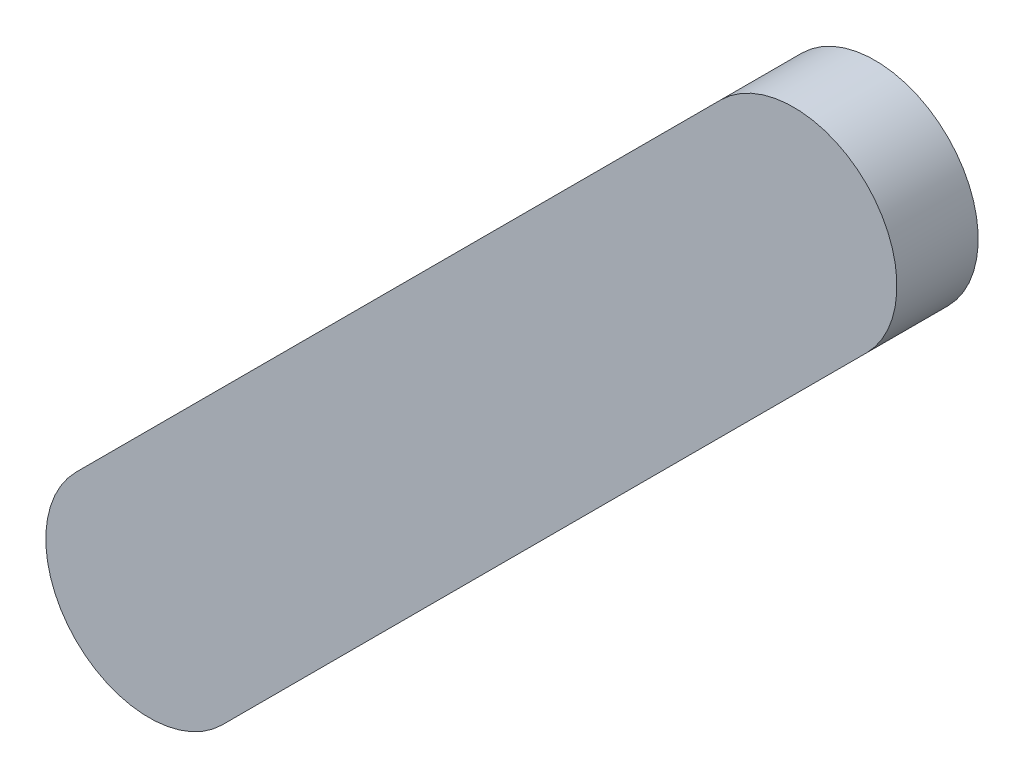
ISO-10303-21;
HEADER;
FILE_DESCRIPTION(('STEP AP214'),'2;1');
FILE_NAME('part.step','',(''),(''),'','','');
FILE_SCHEMA(('AUTOMOTIVE_DESIGN { 1 0 10303 214 1 1 1 1 }'));
ENDSEC;
DATA;
#1=APPLICATION_CONTEXT('core data for automotive mechanical design processes');
#2=APPLICATION_PROTOCOL_DEFINITION('international standard','automotive_design',2000,#1);
#3=PRODUCT_CONTEXT('',#1,'mechanical');
#4=PRODUCT('Part','Part','',(#3));
#5=PRODUCT_RELATED_PRODUCT_CATEGORY('part','',(#4));
#6=PRODUCT_DEFINITION_FORMATION('','',#4);
#7=PRODUCT_DEFINITION_CONTEXT('part definition',#1,'design');
#8=PRODUCT_DEFINITION('design','',#6,#7);
#9=PRODUCT_DEFINITION_SHAPE('','',#8);
#10=(LENGTH_UNIT() NAMED_UNIT(*) SI_UNIT(.MILLI.,.METRE.));
#11=(NAMED_UNIT(*) PLANE_ANGLE_UNIT() SI_UNIT($,.RADIAN.));
#12=(NAMED_UNIT(*) SI_UNIT($,.STERADIAN.) SOLID_ANGLE_UNIT());
#13=UNCERTAINTY_MEASURE_WITH_UNIT(LENGTH_MEASURE(1.E-05),#10,'distance_accuracy_value','');
#14=(GEOMETRIC_REPRESENTATION_CONTEXT(3) GLOBAL_UNCERTAINTY_ASSIGNED_CONTEXT((#13)) GLOBAL_UNIT_ASSIGNED_CONTEXT((#10,
#11,#12)) REPRESENTATION_CONTEXT('',''));
#15=CARTESIAN_POINT('',(0.,0.,0.));
#16=DIRECTION('',(0.,0.,1.));
#17=DIRECTION('',(1.,0.,0.));
#18=AXIS2_PLACEMENT_3D('',#15,#16,#17);
#19=CARTESIAN_POINT('',(138.42060708,65.10602422,0.));
#20=DIRECTION('',(-0.707107347406713,0.707106214965928,0.));
#21=DIRECTION('',(0.707106214965928,0.707107347406713,0.));
#22=AXIS2_PLACEMENT_3D('',#19,#20,#21);
#23=PLANE('',#22);
#24=DIRECTION('',(0.707106214965928,0.707107347406713,0.));
#25=VECTOR('',#24,1.);
#26=CARTESIAN_POINT('',(138.42060708,65.10602422,0.1999996));
#27=LINE('',#26,#25);
#28=CARTESIAN_POINT('',(138.42060708,65.10602422,0.1999996));
#29=VERTEX_POINT('',#28);
#30=CARTESIAN_POINT('',(140.00660594,66.69202562,0.1999996));
#31=VERTEX_POINT('',#30);
#32=EDGE_CURVE('E11',#29,#31,#27,.T.);
#33=ORIENTED_EDGE('',*,*,#32,.F.);
#34=DIRECTION('',(0.,0.,1.));
#35=VECTOR('',#34,1.);
#36=CARTESIAN_POINT('',(138.42060708,65.10602422,0.));
#37=LINE('',#36,#35);
#38=CARTESIAN_POINT('',(138.42060708,65.10602422,0.));
#39=VERTEX_POINT('',#38);
#40=EDGE_CURVE('E24',#39,#29,#37,.T.);
#41=ORIENTED_EDGE('',*,*,#40,.F.);
#42=DIRECTION('',(0.707106214965928,0.707107347406713,0.));
#43=VECTOR('',#42,1.);
#44=CARTESIAN_POINT('',(138.42060708,65.10602422,0.));
#45=LINE('',#44,#43);
#46=CARTESIAN_POINT('',(140.00660594,66.69202562,0.));
#47=VERTEX_POINT('',#46);
#48=EDGE_CURVE('E75',#39,#47,#45,.T.);
#49=ORIENTED_EDGE('',*,*,#48,.T.);
#50=DIRECTION('',(0.,0.,1.));
#51=VECTOR('',#50,1.);
#52=CARTESIAN_POINT('',(140.00660594,66.69202562,0.));
#53=LINE('',#52,#51);
#54=EDGE_CURVE('E37',#47,#31,#53,.T.);
#55=ORIENTED_EDGE('',*,*,#54,.T.);
#56=EDGE_LOOP('',(#33,#41,#49,#55));
#57=FACE_BOUND('',#56,.T.);
#58=ADVANCED_FACE('F17',(#57),#23,.F.);
#59=CARTESIAN_POINT('',(139.82700127,66.87163029,0.));
#60=DIRECTION('',(0.,0.,-1.));
#61=DIRECTION('',(0.707106781186548,-0.707106781186548,0.));
#62=AXIS2_PLACEMENT_3D('',#59,#60,#61);
#63=CYLINDRICAL_SURFACE('',#62,0.253999360179542);
#64=CARTESIAN_POINT('',(139.82700127,66.87163029,0.1999996));
#65=DIRECTION('',(0.,0.,1.));
#66=DIRECTION('',(0.707106781186548,-0.707106781186548,0.));
#67=AXIS2_PLACEMENT_3D('',#64,#65,#66);
#68=CIRCLE('',#67,0.253999360179542);
#69=CARTESIAN_POINT('',(139.6473966,67.05123496,0.1999996));
#70=VERTEX_POINT('',#69);
#71=EDGE_CURVE('E83',#31,#70,#68,.T.);
#72=ORIENTED_EDGE('',*,*,#71,.F.);
#73=ORIENTED_EDGE('',*,*,#54,.F.);
#74=CARTESIAN_POINT('',(139.82700127,66.87163029,0.));
#75=DIRECTION('',(0.,0.,1.));
#76=DIRECTION('',(0.707106781186548,-0.707106781186548,0.));
#77=AXIS2_PLACEMENT_3D('',#74,#75,#76);
#78=CIRCLE('',#77,0.253999360179542);
#79=CARTESIAN_POINT('',(139.6473966,67.05123496,0.));
#80=VERTEX_POINT('',#79);
#81=EDGE_CURVE('E81',#47,#80,#78,.T.);
#82=ORIENTED_EDGE('',*,*,#81,.T.);
#83=DIRECTION('',(0.,0.,1.));
#84=VECTOR('',#83,1.);
#85=CARTESIAN_POINT('',(139.6473966,67.05123496,0.));
#86=LINE('',#85,#84);
#87=EDGE_CURVE('E67',#80,#70,#86,.T.);
#88=ORIENTED_EDGE('',*,*,#87,.T.);
#89=EDGE_LOOP('',(#72,#73,#82,#88));
#90=FACE_BOUND('',#89,.T.);
#91=ADVANCED_FACE('F89',(#90),#63,.T.);
#92=CARTESIAN_POINT('',(139.6473966,67.05123496,0.));
#93=DIRECTION('',(0.707106214965928,-0.707107347406713,0.));
#94=DIRECTION('',(-0.707107347406713,-0.707106214965928,0.));
#95=AXIS2_PLACEMENT_3D('',#92,#93,#94);
#96=PLANE('',#95);
#97=DIRECTION('',(-0.707107347406713,-0.707106214965928,0.));
#98=VECTOR('',#97,1.);
#99=CARTESIAN_POINT('',(139.6473966,67.05123496,0.1999996));
#100=LINE('',#99,#98);
#101=CARTESIAN_POINT('',(138.0613952,65.4652361,0.1999996));
#102=VERTEX_POINT('',#101);
#103=EDGE_CURVE('E71',#70,#102,#100,.T.);
#104=ORIENTED_EDGE('',*,*,#103,.F.);
#105=ORIENTED_EDGE('',*,*,#87,.F.);
#106=DIRECTION('',(-0.707107347406713,-0.707106214965928,0.));
#107=VECTOR('',#106,1.);
#108=CARTESIAN_POINT('',(139.6473966,67.05123496,0.));
#109=LINE('',#108,#107);
#110=CARTESIAN_POINT('',(138.0613952,65.4652361,0.));
#111=VERTEX_POINT('',#110);
#112=EDGE_CURVE('E63',#80,#111,#109,.T.);
#113=ORIENTED_EDGE('',*,*,#112,.T.);
#114=DIRECTION('',(0.,0.,1.));
#115=VECTOR('',#114,1.);
#116=CARTESIAN_POINT('',(138.0613952,65.4652361,0.));
#117=LINE('',#116,#115);
#118=EDGE_CURVE('E53',#111,#102,#117,.T.);
#119=ORIENTED_EDGE('',*,*,#118,.T.);
#120=EDGE_LOOP('',(#104,#105,#113,#119));
#121=FACE_BOUND('',#120,.T.);
#122=ADVANCED_FACE('F66',(#121),#96,.F.);
#123=CARTESIAN_POINT('',(138.24100114,65.28563016,0.));
#124=DIRECTION('',(0.,0.,-1.));
#125=DIRECTION('',(-0.70710678118652,0.707106781186576,0.));
#126=AXIS2_PLACEMENT_3D('',#123,#124,#125);
#127=CYLINDRICAL_SURFACE('',#126,0.254001156230768);
#128=CARTESIAN_POINT('',(138.24100114,65.28563016,0.1999996));
#129=DIRECTION('',(0.,0.,1.));
#130=DIRECTION('',(-0.70710678118652,0.707106781186576,0.));
#131=AXIS2_PLACEMENT_3D('',#128,#129,#130);
#132=CIRCLE('',#131,0.254001156230768);
#133=EDGE_CURVE('E59',#102,#29,#132,.T.);
#134=ORIENTED_EDGE('',*,*,#133,.F.);
#135=ORIENTED_EDGE('',*,*,#118,.F.);
#136=CARTESIAN_POINT('',(138.24100114,65.28563016,0.));
#137=DIRECTION('',(0.,0.,1.));
#138=DIRECTION('',(-0.70710678118652,0.707106781186576,0.));
#139=AXIS2_PLACEMENT_3D('',#136,#137,#138);
#140=CIRCLE('',#139,0.254001156230768);
#141=EDGE_CURVE('E57',#111,#39,#140,.T.);
#142=ORIENTED_EDGE('',*,*,#141,.T.);
#143=ORIENTED_EDGE('',*,*,#40,.T.);
#144=EDGE_LOOP('',(#134,#135,#142,#143));
#145=FACE_BOUND('',#144,.T.);
#146=ADVANCED_FACE('F55',(#145),#127,.T.);
#147=CARTESIAN_POINT('',(138.42060708,65.10602422,0.));
#148=DIRECTION('',(0.,0.,-1.));
#149=DIRECTION('',(-1.,0.,0.));
#150=AXIS2_PLACEMENT_3D('',#147,#148,#149);
#151=PLANE('',#150);
#152=ORIENTED_EDGE('',*,*,#141,.F.);
#153=ORIENTED_EDGE('',*,*,#112,.F.);
#154=ORIENTED_EDGE('',*,*,#81,.F.);
#155=ORIENTED_EDGE('',*,*,#48,.F.);
#156=EDGE_LOOP('',(#152,#153,#154,#155));
#157=FACE_BOUND('',#156,.T.);
#158=ADVANCED_FACE('F74',(#157),#151,.T.);
#159=CARTESIAN_POINT('',(138.42060708,65.10602422,0.1999996));
#160=DIRECTION('',(0.,0.,-1.));
#161=DIRECTION('',(-1.,0.,0.));
#162=AXIS2_PLACEMENT_3D('',#159,#160,#161);
#163=PLANE('',#162);
#164=ORIENTED_EDGE('',*,*,#32,.T.);
#165=ORIENTED_EDGE('',*,*,#71,.T.);
#166=ORIENTED_EDGE('',*,*,#103,.T.);
#167=ORIENTED_EDGE('',*,*,#133,.T.);
#168=EDGE_LOOP('',(#164,#165,#166,#167));
#169=FACE_BOUND('',#168,.T.);
#170=ADVANCED_FACE('F91',(#169),#163,.F.);
#171=CLOSED_SHELL('',(#58,#91,#122,#146,#158,#170));
#172=MANIFOLD_SOLID_BREP('B1',#171);
#173=ADVANCED_BREP_SHAPE_REPRESENTATION('',(#18,#172),#14);
#174=SHAPE_DEFINITION_REPRESENTATION(#9,#173);
ENDSEC;
END-ISO-10303-21;
